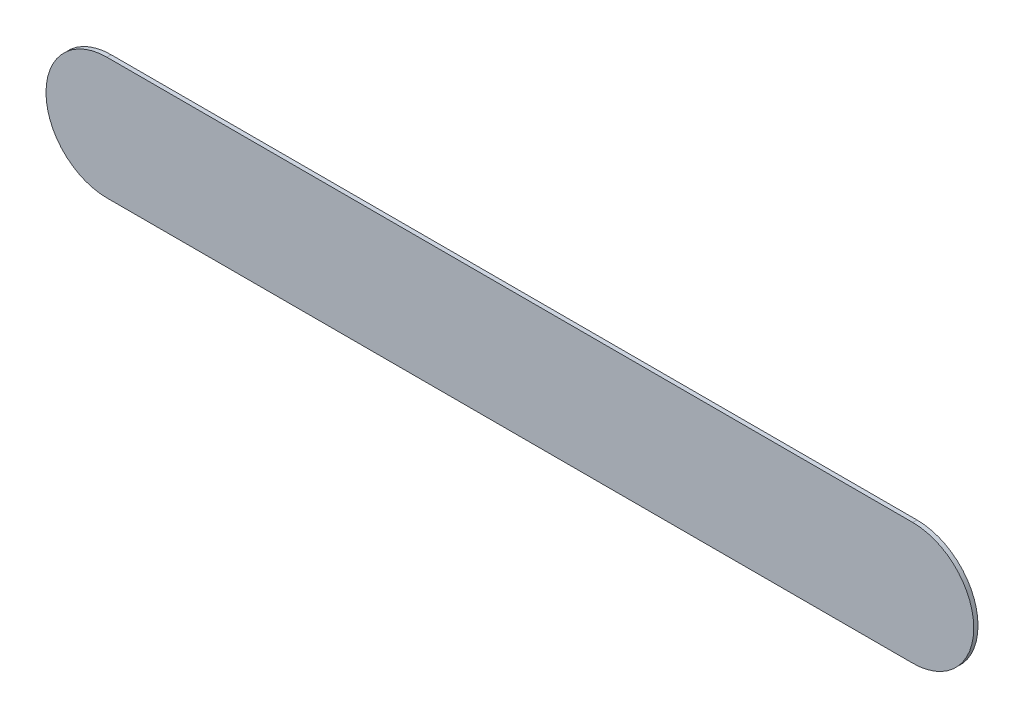
ISO-10303-21;
HEADER;
FILE_DESCRIPTION(('STEP AP214'),'2;1');
FILE_NAME('part.step','',(''),(''),'','','');
FILE_SCHEMA(('AUTOMOTIVE_DESIGN { 1 0 10303 214 1 1 1 1 }'));
ENDSEC;
DATA;
#1=APPLICATION_CONTEXT('core data for automotive mechanical design processes');
#2=APPLICATION_PROTOCOL_DEFINITION('international standard','automotive_design',2000,#1);
#3=PRODUCT_CONTEXT('',#1,'mechanical');
#4=PRODUCT('Part','Part','',(#3));
#5=PRODUCT_RELATED_PRODUCT_CATEGORY('part','',(#4));
#6=PRODUCT_DEFINITION_FORMATION('','',#4);
#7=PRODUCT_DEFINITION_CONTEXT('part definition',#1,'design');
#8=PRODUCT_DEFINITION('design','',#6,#7);
#9=PRODUCT_DEFINITION_SHAPE('','',#8);
#10=(LENGTH_UNIT() NAMED_UNIT(*) SI_UNIT(.MILLI.,.METRE.));
#11=(NAMED_UNIT(*) PLANE_ANGLE_UNIT() SI_UNIT($,.RADIAN.));
#12=(NAMED_UNIT(*) SI_UNIT($,.STERADIAN.) SOLID_ANGLE_UNIT());
#13=UNCERTAINTY_MEASURE_WITH_UNIT(LENGTH_MEASURE(1.E-05),#10,'distance_accuracy_value','');
#14=(GEOMETRIC_REPRESENTATION_CONTEXT(3) GLOBAL_UNCERTAINTY_ASSIGNED_CONTEXT((#13)) GLOBAL_UNIT_ASSIGNED_CONTEXT((#10,
#11,#12)) REPRESENTATION_CONTEXT('',''));
#15=CARTESIAN_POINT('',(0.,0.,0.));
#16=DIRECTION('',(0.,0.,1.));
#17=DIRECTION('',(1.,0.,0.));
#18=AXIS2_PLACEMENT_3D('',#15,#16,#17);
#19=CARTESIAN_POINT('',(96.43,-81.27,1.635));
#20=DIRECTION('',(0.,0.,1.));
#21=DIRECTION('',(1.,0.,0.));
#22=AXIS2_PLACEMENT_3D('',#19,#20,#21);
#23=PLANE('',#22);
#24=DIRECTION('',(1.,0.,0.));
#25=VECTOR('',#24,1.);
#26=CARTESIAN_POINT('',(96.43,-81.27,1.635));
#27=LINE('',#26,#25);
#28=CARTESIAN_POINT('',(96.43,-81.27,1.635));
#29=VERTEX_POINT('',#28);
#30=CARTESIAN_POINT('',(103.039,-81.27,1.635));
#31=VERTEX_POINT('',#30);
#32=EDGE_CURVE('E82',#29,#31,#27,.T.);
#33=ORIENTED_EDGE('',*,*,#32,.T.);
#34=CARTESIAN_POINT('',(103.039,-80.77,1.635));
#35=DIRECTION('',(0.,0.,1.));
#36=DIRECTION('',(0.,-1.,0.));
#37=AXIS2_PLACEMENT_3D('',#34,#35,#36);
#38=CIRCLE('',#37,0.5);
#39=CARTESIAN_POINT('',(103.039,-80.27,1.635));
#40=VERTEX_POINT('',#39);
#41=EDGE_CURVE('E105',#31,#40,#38,.T.);
#42=ORIENTED_EDGE('',*,*,#41,.T.);
#43=DIRECTION('',(-1.,0.,0.));
#44=VECTOR('',#43,1.);
#45=CARTESIAN_POINT('',(103.039,-80.27,1.635));
#46=LINE('',#45,#44);
#47=CARTESIAN_POINT('',(96.43,-80.27,1.635));
#48=VERTEX_POINT('',#47);
#49=EDGE_CURVE('E74',#40,#48,#46,.T.);
#50=ORIENTED_EDGE('',*,*,#49,.T.);
#51=CARTESIAN_POINT('',(96.43,-80.77,1.635));
#52=DIRECTION('',(0.,0.,1.));
#53=DIRECTION('',(0.,1.,0.));
#54=AXIS2_PLACEMENT_3D('',#51,#52,#53);
#55=CIRCLE('',#54,0.5);
#56=EDGE_CURVE('E11',#48,#29,#55,.T.);
#57=ORIENTED_EDGE('',*,*,#56,.T.);
#58=EDGE_LOOP('',(#33,#42,#50,#57));
#59=FACE_BOUND('',#58,.T.);
#60=ADVANCED_FACE('F17',(#59),#23,.T.);
#61=CARTESIAN_POINT('',(96.43,-81.27,1.6));
#62=DIRECTION('',(0.,0.,1.));
#63=DIRECTION('',(1.,0.,0.));
#64=AXIS2_PLACEMENT_3D('',#61,#62,#63);
#65=PLANE('',#64);
#66=CARTESIAN_POINT('',(96.43,-80.77,1.6));
#67=DIRECTION('',(0.,0.,1.));
#68=DIRECTION('',(0.,1.,0.));
#69=AXIS2_PLACEMENT_3D('',#66,#67,#68);
#70=CIRCLE('',#69,0.5);
#71=CARTESIAN_POINT('',(96.43,-80.27,1.6));
#72=VERTEX_POINT('',#71);
#73=CARTESIAN_POINT('',(96.43,-81.27,1.6));
#74=VERTEX_POINT('',#73);
#75=EDGE_CURVE('E25',#72,#74,#70,.T.);
#76=ORIENTED_EDGE('',*,*,#75,.F.);
#77=DIRECTION('',(-1.,0.,0.));
#78=VECTOR('',#77,1.);
#79=CARTESIAN_POINT('',(103.039,-80.27,1.6));
#80=LINE('',#79,#78);
#81=CARTESIAN_POINT('',(103.039,-80.27,1.6));
#82=VERTEX_POINT('',#81);
#83=EDGE_CURVE('E108',#82,#72,#80,.T.);
#84=ORIENTED_EDGE('',*,*,#83,.F.);
#85=CARTESIAN_POINT('',(103.039,-80.77,1.6));
#86=DIRECTION('',(0.,0.,1.));
#87=DIRECTION('',(0.,-1.,0.));
#88=AXIS2_PLACEMENT_3D('',#85,#86,#87);
#89=CIRCLE('',#88,0.5);
#90=CARTESIAN_POINT('',(103.039,-81.27,1.6));
#91=VERTEX_POINT('',#90);
#92=EDGE_CURVE('E84',#91,#82,#89,.T.);
#93=ORIENTED_EDGE('',*,*,#92,.F.);
#94=DIRECTION('',(1.,0.,0.));
#95=VECTOR('',#94,1.);
#96=CARTESIAN_POINT('',(96.43,-81.27,1.6));
#97=LINE('',#96,#95);
#98=EDGE_CURVE('E80',#74,#91,#97,.T.);
#99=ORIENTED_EDGE('',*,*,#98,.F.);
#100=EDGE_LOOP('',(#76,#84,#93,#99));
#101=FACE_BOUND('',#100,.T.);
#102=ADVANCED_FACE('F86',(#101),#65,.F.);
#103=CARTESIAN_POINT('',(96.43,-80.77,1.6));
#104=DIRECTION('',(0.,0.,-1.));
#105=DIRECTION('',(0.,1.,0.));
#106=AXIS2_PLACEMENT_3D('',#103,#104,#105);
#107=CYLINDRICAL_SURFACE('',#106,0.5);
#108=ORIENTED_EDGE('',*,*,#75,.T.);
#109=DIRECTION('',(0.,0.,1.));
#110=VECTOR('',#109,1.);
#111=CARTESIAN_POINT('',(96.43,-81.27,1.6));
#112=LINE('',#111,#110);
#113=EDGE_CURVE('E68',#74,#29,#112,.T.);
#114=ORIENTED_EDGE('',*,*,#113,.T.);
#115=ORIENTED_EDGE('',*,*,#56,.F.);
#116=DIRECTION('',(0.,0.,1.));
#117=VECTOR('',#116,1.);
#118=CARTESIAN_POINT('',(96.43,-80.27,1.6));
#119=LINE('',#118,#117);
#120=EDGE_CURVE('E71',#72,#48,#119,.T.);
#121=ORIENTED_EDGE('',*,*,#120,.F.);
#122=EDGE_LOOP('',(#108,#114,#115,#121));
#123=FACE_BOUND('',#122,.T.);
#124=ADVANCED_FACE('F67',(#123),#107,.T.);
#125=CARTESIAN_POINT('',(103.039,-80.27,1.6));
#126=DIRECTION('',(0.,-1.,0.));
#127=DIRECTION('',(0.,0.,-1.));
#128=AXIS2_PLACEMENT_3D('',#125,#126,#127);
#129=PLANE('',#128);
#130=ORIENTED_EDGE('',*,*,#83,.T.);
#131=ORIENTED_EDGE('',*,*,#120,.T.);
#132=ORIENTED_EDGE('',*,*,#49,.F.);
#133=DIRECTION('',(0.,0.,1.));
#134=VECTOR('',#133,1.);
#135=CARTESIAN_POINT('',(103.039,-80.27,1.6));
#136=LINE('',#135,#134);
#137=EDGE_CURVE('E101',#82,#40,#136,.T.);
#138=ORIENTED_EDGE('',*,*,#137,.F.);
#139=EDGE_LOOP('',(#130,#131,#132,#138));
#140=FACE_BOUND('',#139,.T.);
#141=ADVANCED_FACE('F117',(#140),#129,.F.);
#142=CARTESIAN_POINT('',(103.039,-80.77,1.6));
#143=DIRECTION('',(0.,0.,-1.));
#144=DIRECTION('',(0.,-1.,0.));
#145=AXIS2_PLACEMENT_3D('',#142,#143,#144);
#146=CYLINDRICAL_SURFACE('',#145,0.5);
#147=ORIENTED_EDGE('',*,*,#92,.T.);
#148=ORIENTED_EDGE('',*,*,#137,.T.);
#149=ORIENTED_EDGE('',*,*,#41,.F.);
#150=DIRECTION('',(0.,0.,1.));
#151=VECTOR('',#150,1.);
#152=CARTESIAN_POINT('',(103.039,-81.27,1.6));
#153=LINE('',#152,#151);
#154=EDGE_CURVE('E90',#91,#31,#153,.T.);
#155=ORIENTED_EDGE('',*,*,#154,.F.);
#156=EDGE_LOOP('',(#147,#148,#149,#155));
#157=FACE_BOUND('',#156,.T.);
#158=ADVANCED_FACE('F119',(#157),#146,.T.);
#159=CARTESIAN_POINT('',(96.43,-81.27,1.6));
#160=DIRECTION('',(0.,1.,0.));
#161=DIRECTION('',(1.,0.,0.));
#162=AXIS2_PLACEMENT_3D('',#159,#160,#161);
#163=PLANE('',#162);
#164=ORIENTED_EDGE('',*,*,#98,.T.);
#165=ORIENTED_EDGE('',*,*,#154,.T.);
#166=ORIENTED_EDGE('',*,*,#32,.F.);
#167=ORIENTED_EDGE('',*,*,#113,.F.);
#168=EDGE_LOOP('',(#164,#165,#166,#167));
#169=FACE_BOUND('',#168,.T.);
#170=ADVANCED_FACE('F78',(#169),#163,.F.);
#171=CLOSED_SHELL('',(#60,#102,#124,#141,#158,#170));
#172=MANIFOLD_SOLID_BREP('B1',#171);
#173=ADVANCED_BREP_SHAPE_REPRESENTATION('',(#18,#172),#14);
#174=SHAPE_DEFINITION_REPRESENTATION(#9,#173);
ENDSEC;
END-ISO-10303-21;
